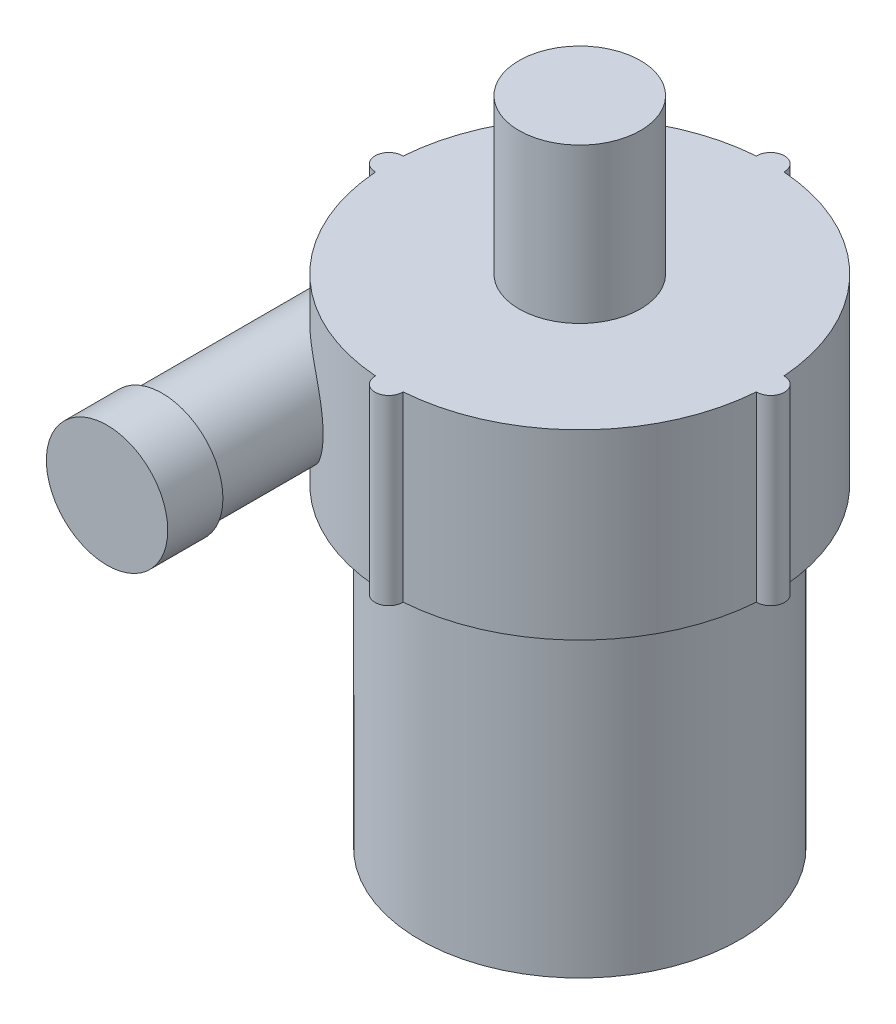
ISO-10303-21;
HEADER;
FILE_DESCRIPTION(('STEP AP214'),'2;1');
FILE_NAME('part.step','',(''),(''),'','','');
FILE_SCHEMA(('AUTOMOTIVE_DESIGN { 1 0 10303 214 1 1 1 1 }'));
ENDSEC;
DATA;
#1=APPLICATION_CONTEXT('core data for automotive mechanical design processes');
#2=APPLICATION_PROTOCOL_DEFINITION('international standard','automotive_design',2000,#1);
#3=PRODUCT_CONTEXT('',#1,'mechanical');
#4=PRODUCT('Part','Part','',(#3));
#5=PRODUCT_RELATED_PRODUCT_CATEGORY('part','',(#4));
#6=PRODUCT_DEFINITION_FORMATION('','',#4);
#7=PRODUCT_DEFINITION_CONTEXT('part definition',#1,'design');
#8=PRODUCT_DEFINITION('design','',#6,#7);
#9=PRODUCT_DEFINITION_SHAPE('','',#8);
#10=(LENGTH_UNIT() NAMED_UNIT(*) SI_UNIT(.MILLI.,.METRE.));
#11=(NAMED_UNIT(*) PLANE_ANGLE_UNIT() SI_UNIT($,.RADIAN.));
#12=(NAMED_UNIT(*) SI_UNIT($,.STERADIAN.) SOLID_ANGLE_UNIT());
#13=UNCERTAINTY_MEASURE_WITH_UNIT(LENGTH_MEASURE(1.E-05),#10,'distance_accuracy_value','');
#14=(GEOMETRIC_REPRESENTATION_CONTEXT(3) GLOBAL_UNCERTAINTY_ASSIGNED_CONTEXT((#13)) GLOBAL_UNIT_ASSIGNED_CONTEXT((#10,
#11,#12)) REPRESENTATION_CONTEXT('',''));
#15=CARTESIAN_POINT('',(0.,0.,0.));
#16=DIRECTION('',(0.,0.,1.));
#17=DIRECTION('',(1.,0.,0.));
#18=AXIS2_PLACEMENT_3D('',#15,#16,#17);
#19=CARTESIAN_POINT('',(-25.6650872187854,72.4466762294143,60.));
#20=DIRECTION('',(0.,0.,-1.));
#21=DIRECTION('',(-1.,0.,0.));
#22=AXIS2_PLACEMENT_3D('',#19,#20,#21);
#23=CYLINDRICAL_SURFACE('',#22,10.);
#24=CARTESIAN_POINT('',(-34.5096820809248,77.1128461496613,2.49836800201541));
#25=CARTESIAN_POINT('',(-34.4853113150492,77.1590201085809,2.83502626775479));
#26=CARTESIAN_POINT('',(-34.4561023355816,77.2135364572343,3.17005936156878));
#27=CARTESIAN_POINT('',(-34.3882878779566,77.3365362372292,3.83636171110192));
#28=CARTESIAN_POINT('',(-34.3496891248365,77.4050096667242,4.16763348376719));
#29=CARTESIAN_POINT('',(-34.2634471112644,77.5530947323871,4.82556040579594));
#30=CARTESIAN_POINT('',(-34.21582663219,77.632678183484,5.15222500345327));
#31=CARTESIAN_POINT('',(-34.1116723395552,77.8006438532357,5.80190135470688));
#32=CARTESIAN_POINT('',(-34.0551367577172,77.8890278161549,6.12491236997778));
#33=CARTESIAN_POINT('',(-33.9332056916576,78.0725421385356,6.76792639174252));
#34=CARTESIAN_POINT('',(-33.8677952639081,78.1676837449661,7.08792332975304));
#35=CARTESIAN_POINT('',(-33.72828381215,78.3626935184276,7.72457455348926));
#36=CARTESIAN_POINT('',(-33.6541821333483,78.4625620412428,8.04122858540114));
#37=CARTESIAN_POINT('',(-33.4188288508168,78.7668916598312,8.98689797029337));
#38=CARTESIAN_POINT('',(-33.2446020657578,78.975962965291,9.61123662821955));
#39=CARTESIAN_POINT('',(-32.8310092610544,79.4293911805595,10.9475648637801));
#40=CARTESIAN_POINT('',(-32.5856821168959,79.6740447444442,11.6576068086193));
#41=CARTESIAN_POINT('',(-32.0480476715587,80.1530083622439,13.0632542948204));
#42=CARTESIAN_POINT('',(-31.7557441861334,80.3873192542957,13.7588610035379));
#43=CARTESIAN_POINT('',(-31.1237462995893,80.8343306916618,15.134212168924));
#44=CARTESIAN_POINT('',(-30.7841161166731,81.0470598566505,15.8139766870347));
#45=CARTESIAN_POINT('',(-30.0564587400182,81.4403905857857,17.1566837771689));
#46=CARTESIAN_POINT('',(-29.668448893729,81.6210036097494,17.8196322768692));
#47=CARTESIAN_POINT('',(-28.9852743480444,81.8838672055875,18.9016253459878));
#48=CARTESIAN_POINT('',(-28.7038851512874,81.9786112176841,19.326367288287));
#49=CARTESIAN_POINT('',(-28.120327902625,82.1453298874055,20.1660219887628));
#50=CARTESIAN_POINT('',(-27.8181604769648,82.2173052309004,20.5809350426707));
#51=CARTESIAN_POINT('',(-27.1937217868458,82.334252321071,21.3992127632631));
#52=CARTESIAN_POINT('',(-26.8714550521228,82.3792301280187,21.8025800023195));
#53=CARTESIAN_POINT('',(-26.2079446346809,82.4374807589031,22.595813312847));
#54=CARTESIAN_POINT('',(-25.8667047769812,82.4507599497984,22.9856820801035));
#55=CARTESIAN_POINT('',(-25.2361716746481,82.4414196918927,23.6742190129304));
#56=CARTESIAN_POINT('',(-24.9498829764034,82.4253550087158,23.9757271740409));
#57=CARTESIAN_POINT('',(-24.3679300984911,82.3664999502041,24.5669686051414));
#58=CARTESIAN_POINT('',(-24.0722659409067,82.3237096378155,24.8567019028628));
#59=CARTESIAN_POINT('',(-23.4741996162597,82.2084703645329,25.4222560551371));
#60=CARTESIAN_POINT('',(-23.1718072208631,82.136062059732,25.6980954010129));
#61=CARTESIAN_POINT('',(-22.5629054723045,81.9586134764511,26.2343227495155));
#62=CARTESIAN_POINT('',(-22.2563972755853,81.853582188002,26.4947149854412));
#63=CARTESIAN_POINT('',(-21.7144151042606,81.6366966183687,26.9395068748469));
#64=CARTESIAN_POINT('',(-21.4789812928589,81.532096104808,27.1275072130316));
#65=CARTESIAN_POINT('',(-21.0101360443678,81.3010364353865,27.4922228113505));
#66=CARTESIAN_POINT('',(-20.7767241480199,81.1745823877393,27.6689406955426));
#67=CARTESIAN_POINT('',(-20.3143540069209,80.8990176628826,28.0101693553927));
#68=CARTESIAN_POINT('',(-20.0853956844104,80.7499073816528,28.1746803443248));
#69=CARTESIAN_POINT('',(-19.6346972919704,80.4285919437645,28.490601918714));
#70=CARTESIAN_POINT('',(-19.4129573493031,80.2563863802026,28.6420122732807));
#71=CARTESIAN_POINT('',(-18.9779556699987,79.8873929278613,28.9320947732709));
#72=CARTESIAN_POINT('',(-18.7647777200227,79.6904162021208,29.0706530945799));
#73=CARTESIAN_POINT('',(-18.3520822789118,79.2735329984501,29.332931588426));
#74=CARTESIAN_POINT('',(-18.1525651682868,79.0536258822456,29.4566513477213));
#75=CARTESIAN_POINT('',(-17.770578705416,78.5921149499935,29.6886589838175));
#76=CARTESIAN_POINT('',(-17.5881013903771,78.3505213727233,29.7969540812047));
#77=CARTESIAN_POINT('',(-17.2432899591231,77.8472619265367,29.9978130533537));
#78=CARTESIAN_POINT('',(-17.0809526150087,77.5855992850621,30.0903794498872));
#79=CARTESIAN_POINT('',(-16.7994967090365,77.0806131719138,30.2482953892268));
#80=CARTESIAN_POINT('',(-16.6775016605019,76.8395064292505,30.3156287176987));
#81=CARTESIAN_POINT('',(-16.4525138827133,76.3456622494722,30.4383182334311));
#82=CARTESIAN_POINT('',(-16.3495194634168,76.0929258492773,30.4936754859992));
#83=CARTESIAN_POINT('',(-16.1640111964395,75.5778831344016,30.592413961785));
#84=CARTESIAN_POINT('',(-16.0814901871742,75.3155802030172,30.6357993733419));
#85=CARTESIAN_POINT('',(-15.9380484522536,74.7834753853214,30.7106687020759));
#86=CARTESIAN_POINT('',(-15.8771267791216,74.5136738285047,30.7421531413053));
#87=CARTESIAN_POINT('',(-15.7816368315492,73.9902275794063,30.791274421843));
#88=CARTESIAN_POINT('',(-15.7453778115564,73.7369731373378,30.8098029153354));
#89=CARTESIAN_POINT('',(-15.6923667949312,73.2279090501314,30.8368370099531));
#90=CARTESIAN_POINT('',(-15.6756135799223,72.972099565594,30.8453432370922));
#91=CARTESIAN_POINT('',(-15.6618147473913,72.4598649725876,30.8523519048719));
#92=CARTESIAN_POINT('',(-15.6647652510838,72.2034399952165,30.8508563144253));
#93=CARTESIAN_POINT('',(-15.6903291762285,71.6918250006314,30.8378626985202));
#94=CARTESIAN_POINT('',(-15.7129426235846,71.4366349850448,30.8263646598845));
#95=CARTESIAN_POINT('',(-15.7768926354236,70.9346213270046,30.7936830213238));
#96=CARTESIAN_POINT('',(-15.8178330264033,70.6877337264694,30.7727042786698));
#97=CARTESIAN_POINT('',(-15.9178389135387,70.1986907481662,30.7210931851588));
#98=CARTESIAN_POINT('',(-15.9769040094849,69.9565352660344,30.6904610474568));
#99=CARTESIAN_POINT('',(-16.1124752735212,69.4786305140343,30.6195033729553));
#100=CARTESIAN_POINT('',(-16.1889804456414,69.2428808792004,30.5791783896887));
#101=CARTESIAN_POINT('',(-16.3585542034308,68.7793404809263,30.4888000300167));
#102=CARTESIAN_POINT('',(-16.4516229946165,68.5515498162807,30.438746532902));
#103=CARTESIAN_POINT('',(-16.6543293848936,68.103008002809,30.3283162424617));
#104=CARTESIAN_POINT('',(-16.7641323324255,67.8823572108028,30.2678355343384));
#105=CARTESIAN_POINT('',(-16.9982958388547,67.4520051798618,30.136952719425));
#106=CARTESIAN_POINT('',(-17.1226563941137,67.2423039381905,30.0665506151145));
#107=CARTESIAN_POINT('',(-17.38452503746,66.8349999667412,29.9159003988942));
#108=CARTESIAN_POINT('',(-17.5220334442378,66.6373975304164,29.8356520483079));
#109=CARTESIAN_POINT('',(-17.8086742971755,66.255243889521,29.6654495422656));
#110=CARTESIAN_POINT('',(-17.9578070636974,66.0706930449139,29.5754951192883));
#111=CARTESIAN_POINT('',(-18.2735284716763,65.7068219777733,29.3815265130349));
#112=CARTESIAN_POINT('',(-18.4406117699228,65.5281808024479,29.2770440629309));
#113=CARTESIAN_POINT('',(-18.783938896993,65.186618202603,29.0579611024764));
#114=CARTESIAN_POINT('',(-18.9601829553038,65.0236971721827,28.9433603386009));
#115=CARTESIAN_POINT('',(-19.3200206738045,64.7138556739331,28.7044150747868));
#116=CARTESIAN_POINT('',(-19.5036155682954,64.5669379087999,28.5800689350883));
#117=CARTESIAN_POINT('',(-19.8763736056148,64.2891743831787,28.3220966886269));
#118=CARTESIAN_POINT('',(-20.0655374609936,64.15833069055,28.1884693913376));
#119=CARTESIAN_POINT('',(-20.4689242267674,63.8989528027864,27.8971623753559));
#120=CARTESIAN_POINT('',(-20.6836027262513,63.7722783270594,27.7384577004153));
#121=CARTESIAN_POINT('',(-21.1156734142953,63.5380716107196,27.4109803214632));
#122=CARTESIAN_POINT('',(-21.3330657304287,63.4305402736579,27.2422071427228));
#123=CARTESIAN_POINT('',(-21.7687952454548,63.2338556148658,26.8952990836754));
#124=CARTESIAN_POINT('',(-21.9871327267246,63.1447082372489,26.7171611987538));
#125=CARTESIAN_POINT('',(-22.4231166695818,62.9839263331221,26.3523191886662));
#126=CARTESIAN_POINT('',(-22.6407629841037,62.912295315641,26.1656133559773));
#127=CARTESIAN_POINT('',(-23.1953812588167,62.7500507475359,25.6775519459251));
#128=CARTESIAN_POINT('',(-23.5309041470908,62.6712791018685,25.3705567827063));
#129=CARTESIAN_POINT('',(-24.1929173740185,62.5499047229828,24.7400893883411));
#130=CARTESIAN_POINT('',(-24.5194036137282,62.507318151082,24.4166098630888));
#131=CARTESIAN_POINT('',(-25.1610108709771,62.4541931371899,23.7549213282004));
#132=CARTESIAN_POINT('',(-25.4761089353209,62.4437162018296,23.4166853069675));
#133=CARTESIAN_POINT('',(-26.0922695718057,62.4510548367673,22.7281122128087));
#134=CARTESIAN_POINT('',(-26.3933323321571,62.4688700275617,22.3777753022627));
#135=CARTESIAN_POINT('',(-27.1264193404179,62.5441551986883,21.4893956832025));
#136=CARTESIAN_POINT('',(-27.5489632292928,62.6169594873844,20.9447932939698));
#137=CARTESIAN_POINT('',(-28.3574633819923,62.8069832185116,19.8364703482033));
#138=CARTESIAN_POINT('',(-28.7433998039583,62.9242265776096,19.2727396460108));
#139=CARTESIAN_POINT('',(-29.4786924219953,63.1941033826267,18.1281691622881));
#140=CARTESIAN_POINT('',(-29.8279546582269,63.3468246588095,17.5472900953218));
#141=CARTESIAN_POINT('',(-30.4887376974506,63.6791694138447,16.3722709754646));
#142=CARTESIAN_POINT('',(-30.8002654825852,63.8587879020111,15.7781334000113));
#143=CARTESIAN_POINT('',(-31.4851230330411,64.3014528392182,14.3751640610967));
#144=CARTESIAN_POINT('',(-31.8438074676979,64.5721918340424,13.5615722606372));
#145=CARTESIAN_POINT('',(-32.3329781776946,64.9911114225134,12.3261856801752));
#146=CARTESIAN_POINT('',(-32.4879570713665,65.1329599153644,11.9116812834603));
#147=CARTESIAN_POINT('',(-32.7817332463662,65.4184994660462,11.077610263462));
#148=CARTESIAN_POINT('',(-32.9205319448629,65.5621903612817,10.6580440870804));
#149=CARTESIAN_POINT('',(-33.1814508799727,65.8480735136615,9.81554549534181));
#150=CARTESIAN_POINT('',(-33.3036432468813,65.9902696034365,9.39263667240457));
#151=CARTESIAN_POINT('',(-33.5321137036192,66.270707348295,8.54117477017665));
#152=CARTESIAN_POINT('',(-33.6383901204749,66.4089485864384,8.11262110268298));
#153=CARTESIAN_POINT('',(-33.8348033245868,66.6775017647905,7.2499361892791));
#154=CARTESIAN_POINT('',(-33.9249589627312,66.8078228471213,6.81581210260099));
#155=CARTESIAN_POINT('',(-34.0890296599009,67.0560081211039,5.94104298360427));
#156=CARTESIAN_POINT('',(-34.1629497985531,67.1738762029394,5.50040003703735));
#157=CARTESIAN_POINT('',(-34.2595675894844,67.3340900585922,4.84634565090777));
#158=CARTESIAN_POINT('',(-34.2887256482761,67.383493262581,4.63559876755924));
#159=CARTESIAN_POINT('',(-34.3432630255158,67.4775501830468,4.2125722683305));
#160=CARTESIAN_POINT('',(-34.3686426678801,67.5222043065592,4.0002927854748));
#161=CARTESIAN_POINT('',(-34.4155959312894,67.6061266842965,3.57390818965334));
#162=CARTESIAN_POINT('',(-34.4371637408673,67.6453866947909,3.35980080202003));
#163=CARTESIAN_POINT('',(-34.4763817148944,67.7177473180355,2.9301318470722));
#164=CARTESIAN_POINT('',(-34.4940307737359,67.7508461921029,2.71456988700542));
#165=CARTESIAN_POINT('',(-34.5096820809249,67.7805063091674,2.49836800201541));
#166=B_SPLINE_CURVE_WITH_KNOTS('',3,(#24,#25,#26,#27,#28,#29,#30,#31,#32,#33,#34,#35,#36,#37,
#38,#39,#40,#41,#42,#43,#44,#45,#46,#47,#48,#49,#50,#51,#52,#53,#54,#55,#56,#57,#58,#59,#60,#61,
#62,#63,#64,#65,#66,#67,#68,#69,#70,#71,#72,#73,#74,#75,#76,#77,#78,#79,#80,#81,#82,#83,#84,#85,
#86,#87,#88,#89,#90,#91,#92,#93,#94,#95,#96,#97,#98,#99,#100,#101,#102,#103,#104,#105,#106,#107,
#108,#109,#110,#111,#112,#113,#114,#115,#116,#117,#118,#119,#120,#121,#122,#123,#124,#125,#126,
#127,#128,#129,#130,#131,#132,#133,#134,#135,#136,#137,#138,#139,#140,#141,#142,#143,#144,#145,
#146,#147,#148,#149,#150,#151,#152,#153,#154,#155,#156,#157,#158,#159,#160,#161,#162,#163,#164,
#165),.UNSPECIFIED.,.F.,.F.,(4,2,2,2,2,2,2,2,2,2,2,2,2,2,2,2,2,2,2,2,2,2,2,2,2,2,2,2,2,2,2,2,2,
2,2,2,2,2,2,2,2,2,2,2,2,2,2,2,2,2,2,2,2,2,2,2,2,2,2,2,2,2,2,2,2,2,2,2,2,2,4),(0.,
1.02172234654781,2.0427150700565,3.06116317413917,4.07981353831839,5.10020090642525,
6.12066519928523,8.16281324193921,10.531499258117,12.8999929698759,15.2653035827286,
17.6297684943601,19.1835983387737,20.7373813720605,22.2908154893345,23.8439375588187,
25.0911915271751,26.3384425579156,27.5839872242863,28.8291889555869,29.7851090006011,
30.7408059029683,31.6964861038378,32.6521831445382,33.6156660147755,34.5791757110091,
35.5422328765639,36.5051354898278,37.3394608729122,38.1737120097233,39.0076709133198,
39.8415932299399,40.6101808087845,41.378720377339,42.1471086591073,42.9154979531467,
43.6680239856029,44.4205334028228,45.1729998564138,45.9254756470443,46.6859367700865,
47.4463977030598,48.206877073503,48.9673774098263,49.7644735464255,50.5615896607922,
51.3588401873085,52.1561931694606,53.041829320884,53.9275072630261,54.813471125315,
55.6996123264147,57.0821175399265,58.4652398968231,59.8510100007246,61.2367615164096,
63.312899516974,65.3901564646107,67.4726117960275,69.5546812126367,72.3397089295568,
73.7336044696778,75.1273778313079,76.5148893393286,77.9025465906688,79.2885704146802,
80.6741599714832,81.3293322298889,81.9844482892913,82.6405546718172,83.2968459288591),.UNSPECIFIED.);
#167=CARTESIAN_POINT('',(-34.5096820809248,77.1128461496613,2.49836800201543));
#168=VERTEX_POINT('',#167);
#169=CARTESIAN_POINT('',(-34.5096820809248,67.7805063091674,2.49836800201542));
#170=VERTEX_POINT('',#169);
#171=EDGE_CURVE('E46',#168,#170,#166,.T.);
#172=ORIENTED_EDGE('',*,*,#171,.F.);
#173=CARTESIAN_POINT('',(-34.5096820809248,67.7805063091674,2.49836800201542));
#174=CARTESIAN_POINT('',(-34.5707830813048,67.8963143151252,2.50056077028901));
#175=CARTESIAN_POINT('',(-34.6296074128609,68.0133325196718,2.50045974778244));
#176=CARTESIAN_POINT('',(-34.7425758012009,68.2494973984727,2.49657466544167));
#177=CARTESIAN_POINT('',(-34.7967216063456,68.3686432573641,2.49279198797602));
#178=CARTESIAN_POINT('',(-34.9001966960446,68.6087304362818,2.48245395713289));
#179=CARTESIAN_POINT('',(-34.949531067202,68.7296697009716,2.47590157184279));
#180=CARTESIAN_POINT('',(-35.043390744167,68.9732821805282,2.46082558297379));
#181=CARTESIAN_POINT('',(-35.0879155650417,69.0959555688342,2.45230178089426));
#182=CARTESIAN_POINT('',(-35.2140285664151,69.4658243025034,2.42494936112052));
#183=CARTESIAN_POINT('',(-35.2883807303617,69.7153918242216,2.40431054106837));
#184=CARTESIAN_POINT('',(-35.4174246873133,70.2196419539785,2.36355586271931));
#185=CARTESIAN_POINT('',(-35.4721109271444,70.4743259853915,2.34344015362128));
#186=CARTESIAN_POINT('',(-35.5626660637333,70.9943099041068,2.30775280559961));
#187=CARTESIAN_POINT('',(-35.5980025217289,71.259712862288,2.29231451640247));
#188=CARTESIAN_POINT('',(-35.6472772449559,71.79283006295,2.27023199513915));
#189=CARTESIAN_POINT('',(-35.6612200664516,72.0605438010803,2.2635858906177));
#190=CARTESIAN_POINT('',(-35.667556102706,72.5963159913939,2.26060597369063));
#191=CARTESIAN_POINT('',(-35.6599471876993,72.8643744750288,2.26427318045707));
#192=CARTESIAN_POINT('',(-35.6232651679384,73.3987509025379,2.28107898141067));
#193=CARTESIAN_POINT('',(-35.5941875596546,73.6650684693893,2.29421956283241));
#194=CARTESIAN_POINT('',(-35.5130018295519,74.2065116144978,2.32775314069639));
#195=CARTESIAN_POINT('',(-35.4598766389335,74.4814637785375,2.34845763723293));
#196=CARTESIAN_POINT('',(-35.3308183034223,75.0257961010392,2.3917627798444));
#197=CARTESIAN_POINT('',(-35.2548881857866,75.2951769939939,2.41436317396018));
#198=CARTESIAN_POINT('',(-35.1240601585423,75.6943732677904,2.44486447882924));
#199=CARTESIAN_POINT('',(-35.0775341486492,75.8268494357843,2.45447860210494));
#200=CARTESIAN_POINT('',(-34.9788986086092,76.0898390783139,2.47162766272937));
#201=CARTESIAN_POINT('',(-34.9267897285042,76.220352779336,2.47916284177561));
#202=CARTESIAN_POINT('',(-34.8170055694197,76.4793155079456,2.49117785969015));
#203=CARTESIAN_POINT('',(-34.7593251535677,76.6077625003156,2.49565484766211));
#204=CARTESIAN_POINT('',(-34.6385384008943,76.8622215816967,2.50042861766436));
#205=CARTESIAN_POINT('',(-34.5754296932223,76.9882325770367,2.5007235637311));
#206=CARTESIAN_POINT('',(-34.5096820809248,77.1128461496613,2.49836800201542));
#207=B_SPLINE_CURVE_WITH_KNOTS('',3,(#173,#174,#175,#176,#177,#178,#179,#180,#181,#182,#183,
#184,#185,#186,#187,#188,#189,#190,#191,#192,#193,#194,#195,#196,#197,#198,#199,#200,#201,#202,
#203,#204,#205,#206),.UNSPECIFIED.,.F.,.F.,(4,2,2,2,2,2,2,2,2,2,2,2,2,2,2,2,4),(0.,
0.392780498504597,0.785413574712419,1.17762695805262,1.56987985029934,2.35267821804382,
3.1356974555724,3.93929987377022,4.74273112268575,5.54624177029634,6.34992101980328,
7.19132833984136,8.03262401596198,8.45472390094092,8.87677469199644,9.29921839080907,
9.72184754142835),.UNSPECIFIED.);
#208=EDGE_CURVE('E40',#170,#168,#207,.T.);
#209=ORIENTED_EDGE('',*,*,#208,.F.);
#210=EDGE_LOOP('',(#172,#209));
#211=FACE_BOUND('',#210,.T.);
#212=CARTESIAN_POINT('',(-25.6650872187854,72.4466762294143,50.));
#213=DIRECTION('',(0.,0.,1.));
#214=DIRECTION('',(1.,0.,0.));
#215=AXIS2_PLACEMENT_3D('',#212,#213,#214);
#216=CIRCLE('',#215,10.);
#217=CARTESIAN_POINT('',(-15.6650872187854,72.4466762294143,50.));
#218=VERTEX_POINT('',#217);
#219=EDGE_CURVE('E11',#218,#218,#216,.T.);
#220=ORIENTED_EDGE('',*,*,#219,.F.);
#221=EDGE_LOOP('',(#220));
#222=FACE_BOUND('',#221,.T.);
#223=ADVANCED_FACE('F32',(#211,#222),#23,.T.);
#224=CARTESIAN_POINT('',(0.,57.,0.));
#225=DIRECTION('',(0.,1.,0.));
#226=DIRECTION('',(0.,0.,1.));
#227=AXIS2_PLACEMENT_3D('',#224,#225,#226);
#228=CYLINDRICAL_SURFACE('',#227,34.6);
#229=DIRECTION('',(0.,1.,0.));
#230=VECTOR('',#229,1.);
#231=CARTESIAN_POINT('',(-34.5096820809248,73.5,2.49836800201543));
#232=LINE('',#231,#230);
#233=CARTESIAN_POINT('',(-34.5096820809248,90.,2.49836800201542));
#234=VERTEX_POINT('',#233);
#235=EDGE_CURVE('E112',#168,#234,#232,.T.);
#236=ORIENTED_EDGE('',*,*,#235,.F.);
#237=ORIENTED_EDGE('',*,*,#171,.T.);
#238=CARTESIAN_POINT('',(-34.5096820809248,57.,2.49836800201543));
#239=VERTEX_POINT('',#238);
#240=EDGE_CURVE('E109',#239,#170,#232,.T.);
#241=ORIENTED_EDGE('',*,*,#240,.F.);
#242=CARTESIAN_POINT('',(0.,57.,0.));
#243=DIRECTION('',(0.,1.,0.));
#244=DIRECTION('',(0.,0.,1.));
#245=AXIS2_PLACEMENT_3D('',#242,#243,#244);
#246=CIRCLE('',#245,34.6);
#247=CARTESIAN_POINT('',(-2.49836800201506,57.,34.5096820809249));
#248=VERTEX_POINT('',#247);
#249=EDGE_CURVE('E138',#239,#248,#246,.T.);
#250=ORIENTED_EDGE('',*,*,#249,.T.);
#251=DIRECTION('',(0.,1.,0.));
#252=VECTOR('',#251,1.);
#253=CARTESIAN_POINT('',(-2.49836800201506,73.5,34.5096820809249));
#254=LINE('',#253,#252);
#255=CARTESIAN_POINT('',(-2.49836800201506,90.,34.5096820809249));
#256=VERTEX_POINT('',#255);
#257=EDGE_CURVE('E227',#256,#248,#254,.F.);
#258=ORIENTED_EDGE('',*,*,#257,.F.);
#259=CARTESIAN_POINT('',(0.,90.,0.));
#260=DIRECTION('',(0.,1.,0.));
#261=DIRECTION('',(0.,0.,1.));
#262=AXIS2_PLACEMENT_3D('',#259,#260,#261);
#263=CIRCLE('',#262,34.6);
#264=EDGE_CURVE('E143',#234,#256,#263,.T.);
#265=ORIENTED_EDGE('',*,*,#264,.F.);
#266=EDGE_LOOP('',(#236,#237,#241,#250,#258,#265));
#267=FACE_BOUND('',#266,.T.);
#268=ADVANCED_FACE('F107',(#267),#228,.T.);
#269=CARTESIAN_POINT('',(-34.6,57.,1.20563281580388E-13));
#270=DIRECTION('',(0.,1.,0.));
#271=DIRECTION('',(0.,0.,1.));
#272=AXIS2_PLACEMENT_3D('',#269,#270,#271);
#273=CYLINDRICAL_SURFACE('',#272,2.5);
#274=ORIENTED_EDGE('',*,*,#240,.T.);
#275=ORIENTED_EDGE('',*,*,#208,.T.);
#276=ORIENTED_EDGE('',*,*,#235,.T.);
#277=CARTESIAN_POINT('',(-34.6,90.,1.20563281580388E-13));
#278=DIRECTION('',(0.,1.,0.));
#279=DIRECTION('',(0.,0.,1.));
#280=AXIS2_PLACEMENT_3D('',#277,#278,#279);
#281=CIRCLE('',#280,2.5);
#282=CARTESIAN_POINT('',(-34.5096820809249,90.,-2.49836800201518));
#283=VERTEX_POINT('',#282);
#284=EDGE_CURVE('E243',#283,#234,#281,.T.);
#285=ORIENTED_EDGE('',*,*,#284,.F.);
#286=DIRECTION('',(0.,1.,0.));
#287=VECTOR('',#286,1.);
#288=CARTESIAN_POINT('',(-34.5096820809249,73.5,-2.49836800201518));
#289=LINE('',#288,#287);
#290=CARTESIAN_POINT('',(-34.5096820809249,57.,-2.49836800201518));
#291=VERTEX_POINT('',#290);
#292=EDGE_CURVE('E122',#283,#291,#289,.F.);
#293=ORIENTED_EDGE('',*,*,#292,.T.);
#294=CARTESIAN_POINT('',(-34.6,57.,1.20563281580388E-13));
#295=DIRECTION('',(0.,1.,0.));
#296=DIRECTION('',(0.,0.,1.));
#297=AXIS2_PLACEMENT_3D('',#294,#295,#296);
#298=CIRCLE('',#297,2.5);
#299=EDGE_CURVE('E117',#291,#239,#298,.T.);
#300=ORIENTED_EDGE('',*,*,#299,.T.);
#301=EDGE_LOOP('',(#274,#275,#276,#285,#293,#300));
#302=FACE_BOUND('',#301,.T.);
#303=ADVANCED_FACE('F115',(#302),#273,.T.);
#304=DIRECTION('',(0.,1.,0.));
#305=VECTOR('',#304,1.);
#306=CARTESIAN_POINT('',(34.5096820809248,73.5,-2.49836800201567));
#307=LINE('',#306,#305);
#308=CARTESIAN_POINT('',(34.5096820809248,57.,-2.49836800201567));
#309=VERTEX_POINT('',#308);
#310=CARTESIAN_POINT('',(34.5096820809248,90.,-2.49836800201565));
#311=VERTEX_POINT('',#310);
#312=EDGE_CURVE('E237',#309,#311,#307,.T.);
#313=ORIENTED_EDGE('',*,*,#312,.F.);
#314=CARTESIAN_POINT('',(2.4983680020153,57.,-34.5096820809249));
#315=VERTEX_POINT('',#314);
#316=EDGE_CURVE('E139',#309,#315,#246,.T.);
#317=ORIENTED_EDGE('',*,*,#316,.T.);
#318=DIRECTION('',(0.,1.,0.));
#319=VECTOR('',#318,1.);
#320=CARTESIAN_POINT('',(2.4983680020153,73.5,-34.5096820809249));
#321=LINE('',#320,#319);
#322=CARTESIAN_POINT('',(2.4983680020153,90.,-34.5096820809249));
#323=VERTEX_POINT('',#322);
#324=EDGE_CURVE('E126',#323,#315,#321,.F.);
#325=ORIENTED_EDGE('',*,*,#324,.F.);
#326=EDGE_CURVE('E133',#311,#323,#263,.T.);
#327=ORIENTED_EDGE('',*,*,#326,.F.);
#328=EDGE_LOOP('',(#313,#317,#325,#327));
#329=FACE_BOUND('',#328,.T.);
#330=ADVANCED_FACE('F254',(#329),#228,.T.);
#331=DIRECTION('',(0.,1.,0.));
#332=VECTOR('',#331,1.);
#333=CARTESIAN_POINT('',(34.5096820809249,73.5,2.49836800201494));
#334=LINE('',#333,#332);
#335=CARTESIAN_POINT('',(34.5096820809249,90.,2.49836800201494));
#336=VERTEX_POINT('',#335);
#337=CARTESIAN_POINT('',(34.5096820809249,57.,2.49836800201494));
#338=VERTEX_POINT('',#337);
#339=EDGE_CURVE('E416',#336,#338,#334,.F.);
#340=ORIENTED_EDGE('',*,*,#339,.F.);
#341=CARTESIAN_POINT('',(2.49836800201553,90.,34.5096820809248));
#342=VERTEX_POINT('',#341);
#343=EDGE_CURVE('E248',#342,#336,#263,.T.);
#344=ORIENTED_EDGE('',*,*,#343,.F.);
#345=DIRECTION('',(0.,1.,0.));
#346=VECTOR('',#345,1.);
#347=CARTESIAN_POINT('',(2.49836800201555,73.5,34.5096820809248));
#348=LINE('',#347,#346);
#349=CARTESIAN_POINT('',(2.49836800201555,57.,34.5096820809248));
#350=VERTEX_POINT('',#349);
#351=EDGE_CURVE('E235',#350,#342,#348,.T.);
#352=ORIENTED_EDGE('',*,*,#351,.F.);
#353=EDGE_CURVE('E222',#350,#338,#246,.T.);
#354=ORIENTED_EDGE('',*,*,#353,.T.);
#355=EDGE_LOOP('',(#340,#344,#352,#354));
#356=FACE_BOUND('',#355,.T.);
#357=ADVANCED_FACE('F189',(#356),#228,.T.);
#358=CARTESIAN_POINT('',(0.,90.,0.));
#359=DIRECTION('',(0.,1.,0.));
#360=DIRECTION('',(0.,0.,1.));
#361=AXIS2_PLACEMENT_3D('',#358,#359,#360);
#362=PLANE('',#361);
#363=ORIENTED_EDGE('',*,*,#343,.T.);
#364=CARTESIAN_POINT('',(34.6,90.,-3.62557206479153E-13));
#365=DIRECTION('',(0.,1.,0.));
#366=DIRECTION('',(0.,0.,1.));
#367=AXIS2_PLACEMENT_3D('',#364,#365,#366);
#368=CIRCLE('',#367,2.5);
#369=EDGE_CURVE('E54',#336,#311,#368,.T.);
#370=ORIENTED_EDGE('',*,*,#369,.T.);
#371=ORIENTED_EDGE('',*,*,#326,.T.);
#372=CARTESIAN_POINT('',(0.,90.,-34.6));
#373=DIRECTION('',(0.,1.,0.));
#374=DIRECTION('',(0.,0.,1.));
#375=AXIS2_PLACEMENT_3D('',#372,#373,#374);
#376=CIRCLE('',#375,2.5);
#377=CARTESIAN_POINT('',(-2.4983680020153,90.,-34.5096820809249));
#378=VERTEX_POINT('',#377);
#379=EDGE_CURVE('E118',#323,#378,#376,.T.);
#380=ORIENTED_EDGE('',*,*,#379,.T.);
#381=EDGE_CURVE('E140',#378,#283,#263,.T.);
#382=ORIENTED_EDGE('',*,*,#381,.T.);
#383=ORIENTED_EDGE('',*,*,#284,.T.);
#384=ORIENTED_EDGE('',*,*,#264,.T.);
#385=CARTESIAN_POINT('',(2.41610508647945E-13,90.,34.6));
#386=DIRECTION('',(0.,1.,0.));
#387=DIRECTION('',(0.,0.,1.));
#388=AXIS2_PLACEMENT_3D('',#385,#386,#387);
#389=CIRCLE('',#388,2.5);
#390=EDGE_CURVE('E233',#256,#342,#389,.T.);
#391=ORIENTED_EDGE('',*,*,#390,.T.);
#392=EDGE_LOOP('',(#363,#370,#371,#380,#382,#383,#384,#391));
#393=FACE_BOUND('',#392,.T.);
#394=CARTESIAN_POINT('',(0.,90.,0.));
#395=DIRECTION('',(0.,1.,0.));
#396=DIRECTION('',(0.,0.,1.));
#397=AXIS2_PLACEMENT_3D('',#394,#395,#396);
#398=CIRCLE('',#397,11.);
#399=CARTESIAN_POINT('',(0.,90.,11.));
#400=VERTEX_POINT('',#399);
#401=EDGE_CURVE('E147',#400,#400,#398,.T.);
#402=ORIENTED_EDGE('',*,*,#401,.F.);
#403=EDGE_LOOP('',(#402));
#404=FACE_BOUND('',#403,.T.);
#405=ADVANCED_FACE('F196',(#393,#404),#362,.T.);
#406=CARTESIAN_POINT('',(0.,118.,0.));
#407=DIRECTION('',(0.,-1.,0.));
#408=DIRECTION('',(0.,0.,-1.));
#409=AXIS2_PLACEMENT_3D('',#406,#407,#408);
#410=CYLINDRICAL_SURFACE('',#409,11.);
#411=CARTESIAN_POINT('',(0.,118.,0.));
#412=DIRECTION('',(0.,1.,0.));
#413=DIRECTION('',(0.,0.,1.));
#414=AXIS2_PLACEMENT_3D('',#411,#412,#413);
#415=CIRCLE('',#414,11.);
#416=CARTESIAN_POINT('',(0.,118.,11.));
#417=VERTEX_POINT('',#416);
#418=EDGE_CURVE('E137',#417,#417,#415,.T.);
#419=ORIENTED_EDGE('',*,*,#418,.F.);
#420=EDGE_LOOP('',(#419));
#421=FACE_BOUND('',#420,.T.);
#422=ORIENTED_EDGE('',*,*,#401,.T.);
#423=EDGE_LOOP('',(#422));
#424=FACE_BOUND('',#423,.T.);
#425=ADVANCED_FACE('F192',(#421,#424),#410,.T.);
#426=CARTESIAN_POINT('',(0.,118.,0.));
#427=DIRECTION('',(0.,1.,0.));
#428=DIRECTION('',(0.,0.,1.));
#429=AXIS2_PLACEMENT_3D('',#426,#427,#428);
#430=PLANE('',#429);
#431=ORIENTED_EDGE('',*,*,#418,.T.);
#432=EDGE_LOOP('',(#431));
#433=FACE_BOUND('',#432,.T.);
#434=ADVANCED_FACE('F187',(#433),#430,.T.);
#435=ORIENTED_EDGE('',*,*,#292,.F.);
#436=ORIENTED_EDGE('',*,*,#381,.F.);
#437=DIRECTION('',(0.,1.,0.));
#438=VECTOR('',#437,1.);
#439=CARTESIAN_POINT('',(-2.4983680020153,73.5,-34.5096820809249));
#440=LINE('',#439,#438);
#441=CARTESIAN_POINT('',(-2.4983680020153,57.,-34.5096820809249));
#442=VERTEX_POINT('',#441);
#443=EDGE_CURVE('E130',#442,#378,#440,.T.);
#444=ORIENTED_EDGE('',*,*,#443,.F.);
#445=EDGE_CURVE('E134',#442,#291,#246,.T.);
#446=ORIENTED_EDGE('',*,*,#445,.T.);
#447=EDGE_LOOP('',(#435,#436,#444,#446));
#448=FACE_BOUND('',#447,.T.);
#449=ADVANCED_FACE('F181',(#448),#228,.T.);
#450=CARTESIAN_POINT('',(0.,57.,0.));
#451=DIRECTION('',(0.,1.,0.));
#452=DIRECTION('',(0.,0.,1.));
#453=AXIS2_PLACEMENT_3D('',#450,#451,#452);
#454=PLANE('',#453);
#455=CARTESIAN_POINT('',(0.,57.,0.));
#456=DIRECTION('',(0.,1.,0.));
#457=DIRECTION('',(0.,0.,1.));
#458=AXIS2_PLACEMENT_3D('',#455,#456,#457);
#459=CIRCLE('',#458,29.);
#460=CARTESIAN_POINT('',(0.,57.,-29.));
#461=VERTEX_POINT('',#460);
#462=EDGE_CURVE('E104',#461,#461,#459,.T.);
#463=ORIENTED_EDGE('',*,*,#462,.T.);
#464=EDGE_LOOP('',(#463));
#465=FACE_BOUND('',#464,.T.);
#466=ORIENTED_EDGE('',*,*,#316,.F.);
#467=CARTESIAN_POINT('',(34.6,57.,-3.62557206479153E-13));
#468=DIRECTION('',(0.,1.,0.));
#469=DIRECTION('',(0.,0.,1.));
#470=AXIS2_PLACEMENT_3D('',#467,#468,#469);
#471=CIRCLE('',#470,2.5);
#472=EDGE_CURVE('E179',#338,#309,#471,.T.);
#473=ORIENTED_EDGE('',*,*,#472,.F.);
#474=ORIENTED_EDGE('',*,*,#353,.F.);
#475=CARTESIAN_POINT('',(2.41610508647945E-13,57.,34.6));
#476=DIRECTION('',(0.,1.,0.));
#477=DIRECTION('',(0.,0.,1.));
#478=AXIS2_PLACEMENT_3D('',#475,#476,#477);
#479=CIRCLE('',#478,2.5);
#480=EDGE_CURVE('E230',#248,#350,#479,.T.);
#481=ORIENTED_EDGE('',*,*,#480,.F.);
#482=ORIENTED_EDGE('',*,*,#249,.F.);
#483=ORIENTED_EDGE('',*,*,#299,.F.);
#484=ORIENTED_EDGE('',*,*,#445,.F.);
#485=CARTESIAN_POINT('',(0.,57.,-34.6));
#486=DIRECTION('',(0.,1.,0.));
#487=DIRECTION('',(0.,0.,1.));
#488=AXIS2_PLACEMENT_3D('',#485,#486,#487);
#489=CIRCLE('',#488,2.5);
#490=EDGE_CURVE('E120',#315,#442,#489,.T.);
#491=ORIENTED_EDGE('',*,*,#490,.F.);
#492=EDGE_LOOP('',(#466,#473,#474,#481,#482,#483,#484,#491));
#493=FACE_BOUND('',#492,.T.);
#494=ADVANCED_FACE('F186',(#465,#493),#454,.F.);
#495=CARTESIAN_POINT('',(0.,0.,0.));
#496=DIRECTION('',(0.,1.,0.));
#497=DIRECTION('',(0.,0.,1.));
#498=AXIS2_PLACEMENT_3D('',#495,#496,#497);
#499=PLANE('',#498);
#500=CARTESIAN_POINT('',(0.,0.,0.));
#501=DIRECTION('',(0.,1.,0.));
#502=DIRECTION('',(0.,0.,1.));
#503=AXIS2_PLACEMENT_3D('',#500,#501,#502);
#504=CIRCLE('',#503,29.);
#505=CARTESIAN_POINT('',(0.,0.,-29.));
#506=VERTEX_POINT('',#505);
#507=EDGE_CURVE('E146',#506,#506,#504,.T.);
#508=ORIENTED_EDGE('',*,*,#507,.F.);
#509=EDGE_LOOP('',(#508));
#510=FACE_BOUND('',#509,.T.);
#511=ADVANCED_FACE('F199',(#510),#499,.F.);
#512=CARTESIAN_POINT('',(0.,90.,0.));
#513=DIRECTION('',(0.,-1.,0.));
#514=DIRECTION('',(0.,0.,-1.));
#515=AXIS2_PLACEMENT_3D('',#512,#513,#514);
#516=CYLINDRICAL_SURFACE('',#515,29.);
#517=CARTESIAN_POINT('',(0.,0.,-29.));
#518=CARTESIAN_POINT('',(0.,0.593749999999985,-29.));
#519=CARTESIAN_POINT('',(0.,1.18749999999998,-29.));
#520=CARTESIAN_POINT('',(0.,2.37499999999998,-29.));
#521=CARTESIAN_POINT('',(0.,2.96874999999998,-29.));
#522=CARTESIAN_POINT('',(0.,4.15624999999999,-29.));
#523=CARTESIAN_POINT('',(0.,4.74999999999999,-29.));
#524=CARTESIAN_POINT('',(0.,5.93749999999999,-29.));
#525=CARTESIAN_POINT('',(0.,6.53124999999999,-29.));
#526=CARTESIAN_POINT('',(0.,7.71874999999999,-29.));
#527=CARTESIAN_POINT('',(0.,8.31249999999999,-29.));
#528=CARTESIAN_POINT('',(0.,9.49999999999999,-29.));
#529=CARTESIAN_POINT('',(0.,10.09375,-29.));
#530=CARTESIAN_POINT('',(0.,11.28125,-29.));
#531=CARTESIAN_POINT('',(0.,11.875,-29.));
#532=CARTESIAN_POINT('',(0.,13.0625,-29.));
#533=CARTESIAN_POINT('',(0.,13.65625,-29.));
#534=CARTESIAN_POINT('',(0.,14.84375,-29.));
#535=CARTESIAN_POINT('',(0.,15.4375,-29.));
#536=CARTESIAN_POINT('',(0.,16.625,-29.));
#537=CARTESIAN_POINT('',(0.,17.21875,-29.));
#538=CARTESIAN_POINT('',(0.,18.40625,-29.));
#539=CARTESIAN_POINT('',(0.,19.,-29.));
#540=CARTESIAN_POINT('',(0.,20.1875,-29.));
#541=CARTESIAN_POINT('',(0.,20.78125,-29.));
#542=CARTESIAN_POINT('',(0.,21.96875,-29.));
#543=CARTESIAN_POINT('',(0.,22.5625,-29.));
#544=CARTESIAN_POINT('',(0.,23.75,-29.));
#545=CARTESIAN_POINT('',(0.,24.34375,-29.));
#546=CARTESIAN_POINT('',(0.,25.53125,-29.));
#547=CARTESIAN_POINT('',(0.,26.125,-29.));
#548=CARTESIAN_POINT('',(0.,27.3125,-29.));
#549=CARTESIAN_POINT('',(0.,27.90625,-29.));
#550=CARTESIAN_POINT('',(0.,29.09375,-29.));
#551=CARTESIAN_POINT('',(0.,29.6875,-29.));
#552=CARTESIAN_POINT('',(0.,30.875,-29.));
#553=CARTESIAN_POINT('',(0.,31.46875,-29.));
#554=CARTESIAN_POINT('',(0.,32.65625,-29.));
#555=CARTESIAN_POINT('',(0.,33.25,-29.));
#556=CARTESIAN_POINT('',(0.,34.4375,-29.));
#557=CARTESIAN_POINT('',(0.,35.03125,-29.));
#558=CARTESIAN_POINT('',(0.,36.21875,-29.));
#559=CARTESIAN_POINT('',(0.,36.8125,-29.));
#560=CARTESIAN_POINT('',(0.,38.,-29.));
#561=CARTESIAN_POINT('',(0.,38.59375,-29.));
#562=CARTESIAN_POINT('',(0.,39.78125,-29.));
#563=CARTESIAN_POINT('',(0.,40.375,-29.));
#564=CARTESIAN_POINT('',(0.,41.5625,-29.));
#565=CARTESIAN_POINT('',(0.,42.15625,-29.));
#566=CARTESIAN_POINT('',(0.,43.34375,-29.));
#567=CARTESIAN_POINT('',(0.,43.9375,-29.));
#568=CARTESIAN_POINT('',(0.,45.125,-29.));
#569=CARTESIAN_POINT('',(0.,45.71875,-29.));
#570=CARTESIAN_POINT('',(0.,46.90625,-29.));
#571=CARTESIAN_POINT('',(0.,47.5,-29.));
#572=CARTESIAN_POINT('',(0.,48.6875,-29.));
#573=CARTESIAN_POINT('',(0.,49.28125,-29.));
#574=CARTESIAN_POINT('',(0.,50.46875,-29.));
#575=CARTESIAN_POINT('',(0.,51.0625,-29.));
#576=CARTESIAN_POINT('',(0.,52.25,-29.));
#577=CARTESIAN_POINT('',(0.,52.84375,-29.));
#578=CARTESIAN_POINT('',(0.,54.03125,-29.));
#579=CARTESIAN_POINT('',(0.,54.625,-29.));
#580=CARTESIAN_POINT('',(0.,55.8125,-29.));
#581=CARTESIAN_POINT('',(0.,56.40625,-29.));
#582=CARTESIAN_POINT('',(0.,57.,-29.));
#583=B_SPLINE_CURVE_WITH_KNOTS('',3,(#517,#518,#519,#520,#521,#522,#523,#524,#525,#526,#527,
#528,#529,#530,#531,#532,#533,#534,#535,#536,#537,#538,#539,#540,#541,#542,#543,#544,#545,#546,
#547,#548,#549,#550,#551,#552,#553,#554,#555,#556,#557,#558,#559,#560,#561,#562,#563,#564,#565,
#566,#567,#568,#569,#570,#571,#572,#573,#574,#575,#576,#577,#578,#579,#580,#581,#582),
.UNSPECIFIED.,.F.,.F.,(4,2,2,2,2,2,2,2,2,2,2,2,2,2,2,2,2,2,2,2,2,2,2,2,2,2,2,2,2,2,2,2,4),(0.,
1.78125,3.5625,5.34375000000001,7.12500000000001,8.90625,10.6875,12.46875,14.25,16.03125,
17.8125,19.59375,21.375,23.15625,24.9375,26.71875,28.5,30.28125,32.0625,33.84375,35.625,
37.40625,39.1875,40.96875,42.75,44.53125,46.3125,48.09375,49.875,51.65625,53.4375,55.21875,57.),.UNSPECIFIED.);
#584=EDGE_CURVE('BSEAM34',#506,#461,#583,.T.);
#585=ORIENTED_EDGE('',*,*,#507,.T.);
#586=ORIENTED_EDGE('',*,*,#462,.F.);
#587=ORIENTED_EDGE('',*,*,#584,.T.);
#588=ORIENTED_EDGE('',*,*,#584,.F.);
#589=EDGE_LOOP('',(#585,#587,#586,#588));
#590=FACE_BOUND('',#589,.T.);
#591=ADVANCED_FACE('F34',(#590),#516,.T.);
#592=CARTESIAN_POINT('',(0.,57.,-34.6));
#593=DIRECTION('',(0.,1.,0.));
#594=DIRECTION('',(0.,0.,1.));
#595=AXIS2_PLACEMENT_3D('',#592,#593,#594);
#596=CYLINDRICAL_SURFACE('',#595,2.5);
#597=ORIENTED_EDGE('',*,*,#490,.T.);
#598=ORIENTED_EDGE('',*,*,#443,.T.);
#599=ORIENTED_EDGE('',*,*,#379,.F.);
#600=ORIENTED_EDGE('',*,*,#324,.T.);
#601=EDGE_LOOP('',(#597,#598,#599,#600));
#602=FACE_BOUND('',#601,.T.);
#603=ADVANCED_FACE('F206',(#602),#596,.T.);
#604=CARTESIAN_POINT('',(2.41610508647945E-13,57.,34.6));
#605=DIRECTION('',(0.,1.,0.));
#606=DIRECTION('',(0.,0.,1.));
#607=AXIS2_PLACEMENT_3D('',#604,#605,#606);
#608=CYLINDRICAL_SURFACE('',#607,2.5);
#609=ORIENTED_EDGE('',*,*,#480,.T.);
#610=ORIENTED_EDGE('',*,*,#351,.T.);
#611=ORIENTED_EDGE('',*,*,#390,.F.);
#612=ORIENTED_EDGE('',*,*,#257,.T.);
#613=EDGE_LOOP('',(#609,#610,#611,#612));
#614=FACE_BOUND('',#613,.T.);
#615=ADVANCED_FACE('F321',(#614),#608,.T.);
#616=CARTESIAN_POINT('',(34.6,57.,-3.62557206479153E-13));
#617=DIRECTION('',(0.,1.,0.));
#618=DIRECTION('',(0.,0.,1.));
#619=AXIS2_PLACEMENT_3D('',#616,#617,#618);
#620=CYLINDRICAL_SURFACE('',#619,2.5);
#621=ORIENTED_EDGE('',*,*,#472,.T.);
#622=ORIENTED_EDGE('',*,*,#312,.T.);
#623=ORIENTED_EDGE('',*,*,#369,.F.);
#624=ORIENTED_EDGE('',*,*,#339,.T.);
#625=EDGE_LOOP('',(#621,#622,#623,#624));
#626=FACE_BOUND('',#625,.T.);
#627=ADVANCED_FACE('F168',(#626),#620,.T.);
#628=CARTESIAN_POINT('',(-25.6650872187854,72.4466762294143,50.));
#629=DIRECTION('',(0.,0.,1.));
#630=DIRECTION('',(1.,0.,0.));
#631=AXIS2_PLACEMENT_3D('',#628,#629,#630);
#632=CYLINDRICAL_SURFACE('',#631,11.);
#633=CARTESIAN_POINT('',(-25.6650872187854,72.4466762294143,50.));
#634=DIRECTION('',(0.,0.,1.));
#635=DIRECTION('',(1.,0.,0.));
#636=AXIS2_PLACEMENT_3D('',#633,#634,#635);
#637=CIRCLE('',#636,11.);
#638=CARTESIAN_POINT('',(-14.6650872187854,72.4466762294143,50.));
#639=VERTEX_POINT('',#638);
#640=EDGE_CURVE('E113',#639,#639,#637,.T.);
#641=ORIENTED_EDGE('',*,*,#640,.T.);
#642=EDGE_LOOP('',(#641));
#643=FACE_BOUND('',#642,.T.);
#644=CARTESIAN_POINT('',(-25.6650872187854,72.4466762294143,60.));
#645=DIRECTION('',(0.,0.,1.));
#646=DIRECTION('',(1.,0.,0.));
#647=AXIS2_PLACEMENT_3D('',#644,#645,#646);
#648=CIRCLE('',#647,11.);
#649=CARTESIAN_POINT('',(-14.6650872187854,72.4466762294143,60.));
#650=VERTEX_POINT('',#649);
#651=EDGE_CURVE('E177',#650,#650,#648,.T.);
#652=ORIENTED_EDGE('',*,*,#651,.F.);
#653=EDGE_LOOP('',(#652));
#654=FACE_BOUND('',#653,.T.);
#655=ADVANCED_FACE('F282',(#643,#654),#632,.T.);
#656=CARTESIAN_POINT('',(-25.6650872187854,72.4466762294143,50.));
#657=DIRECTION('',(0.,0.,1.));
#658=DIRECTION('',(1.,0.,0.));
#659=AXIS2_PLACEMENT_3D('',#656,#657,#658);
#660=PLANE('',#659);
#661=ORIENTED_EDGE('',*,*,#219,.T.);
#662=EDGE_LOOP('',(#661));
#663=FACE_BOUND('',#662,.T.);
#664=ORIENTED_EDGE('',*,*,#640,.F.);
#665=EDGE_LOOP('',(#664));
#666=FACE_BOUND('',#665,.T.);
#667=ADVANCED_FACE('F286',(#663,#666),#660,.F.);
#668=CARTESIAN_POINT('',(-25.6650872187854,72.4466762294143,60.));
#669=DIRECTION('',(0.,0.,1.));
#670=DIRECTION('',(1.,0.,0.));
#671=AXIS2_PLACEMENT_3D('',#668,#669,#670);
#672=PLANE('',#671);
#673=ORIENTED_EDGE('',*,*,#651,.T.);
#674=EDGE_LOOP('',(#673));
#675=FACE_BOUND('',#674,.T.);
#676=ADVANCED_FACE('F166',(#675),#672,.T.);
#677=CLOSED_SHELL('',(#223,#268,#303,#330,#357,#405,#425,#434,#449,#494,#511,#591,#603,#615,
#627,#655,#667,#676));
#678=MANIFOLD_SOLID_BREP('B2',#677);
#679=ADVANCED_BREP_SHAPE_REPRESENTATION('',(#18,#678),#14);
#680=SHAPE_DEFINITION_REPRESENTATION(#9,#679);
ENDSEC;
END-ISO-10303-21;
